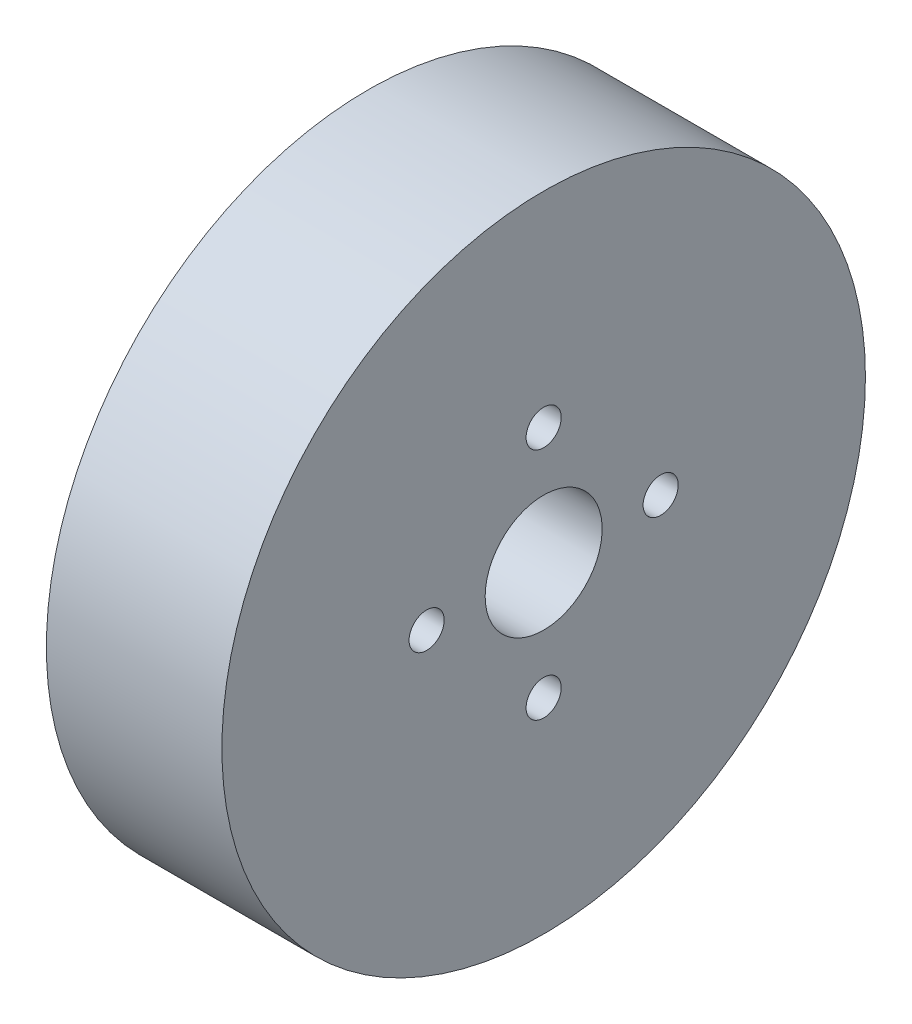
ISO-10303-21;
HEADER;
FILE_DESCRIPTION(('STEP AP214'),'2;1');
FILE_NAME('part.step','',(''),(''),'','','');
FILE_SCHEMA(('AUTOMOTIVE_DESIGN { 1 0 10303 214 1 1 1 1 }'));
ENDSEC;
DATA;
#1=APPLICATION_CONTEXT('core data for automotive mechanical design processes');
#2=APPLICATION_PROTOCOL_DEFINITION('international standard','automotive_design',2000,#1);
#3=PRODUCT_CONTEXT('',#1,'mechanical');
#4=PRODUCT('Part','Part','',(#3));
#5=PRODUCT_RELATED_PRODUCT_CATEGORY('part','',(#4));
#6=PRODUCT_DEFINITION_FORMATION('','',#4);
#7=PRODUCT_DEFINITION_CONTEXT('part definition',#1,'design');
#8=PRODUCT_DEFINITION('design','',#6,#7);
#9=PRODUCT_DEFINITION_SHAPE('','',#8);
#10=(LENGTH_UNIT() NAMED_UNIT(*) SI_UNIT(.MILLI.,.METRE.));
#11=(NAMED_UNIT(*) PLANE_ANGLE_UNIT() SI_UNIT($,.RADIAN.));
#12=(NAMED_UNIT(*) SI_UNIT($,.STERADIAN.) SOLID_ANGLE_UNIT());
#13=UNCERTAINTY_MEASURE_WITH_UNIT(LENGTH_MEASURE(1.E-05),#10,'distance_accuracy_value','');
#14=(GEOMETRIC_REPRESENTATION_CONTEXT(3) GLOBAL_UNCERTAINTY_ASSIGNED_CONTEXT((#13)) GLOBAL_UNIT_ASSIGNED_CONTEXT((#10,
#11,#12)) REPRESENTATION_CONTEXT('',''));
#15=CARTESIAN_POINT('',(0.,0.,0.));
#16=DIRECTION('',(0.,0.,1.));
#17=DIRECTION('',(1.,0.,0.));
#18=AXIS2_PLACEMENT_3D('',#15,#16,#17);
#19=CARTESIAN_POINT('',(15.,14.0619228503121,18.795257752469));
#20=DIRECTION('',(-1.,0.,0.));
#21=DIRECTION('',(0.,0.,1.));
#22=AXIS2_PLACEMENT_3D('',#19,#20,#21);
#23=CYLINDRICAL_SURFACE('',#22,27.5);
#24=CARTESIAN_POINT('',(15.,14.0619228503121,18.795257752469));
#25=DIRECTION('',(1.,0.,0.));
#26=DIRECTION('',(0.,0.,-1.));
#27=AXIS2_PLACEMENT_3D('',#24,#25,#26);
#28=CIRCLE('',#27,27.5);
#29=CARTESIAN_POINT('',(15.,14.0619228503121,-8.70474224753096));
#30=VERTEX_POINT('',#29);
#31=EDGE_CURVE('E10',#30,#30,#28,.T.);
#32=ORIENTED_EDGE('',*,*,#31,.F.);
#33=EDGE_LOOP('',(#32));
#34=FACE_BOUND('',#33,.T.);
#35=CARTESIAN_POINT('',(0.,14.0619228503121,18.795257752469));
#36=DIRECTION('',(1.,0.,0.));
#37=DIRECTION('',(0.,0.,-1.));
#38=AXIS2_PLACEMENT_3D('',#35,#36,#37);
#39=CIRCLE('',#38,27.5);
#40=CARTESIAN_POINT('',(0.,14.0619228503121,-8.70474224753096));
#41=VERTEX_POINT('',#40);
#42=EDGE_CURVE('E35',#41,#41,#39,.T.);
#43=ORIENTED_EDGE('',*,*,#42,.T.);
#44=EDGE_LOOP('',(#43));
#45=FACE_BOUND('',#44,.T.);
#46=ADVANCED_FACE('F32',(#34,#45),#23,.T.);
#47=CARTESIAN_POINT('',(15.,14.0619228503121,18.795257752469));
#48=DIRECTION('',(1.,0.,0.));
#49=DIRECTION('',(0.,0.,-1.));
#50=AXIS2_PLACEMENT_3D('',#47,#48,#49);
#51=PLANE('',#50);
#52=CARTESIAN_POINT('',(15.,24.0619228503121,18.795257752469));
#53=DIRECTION('',(1.,0.,0.));
#54=DIRECTION('',(0.,0.,-1.));
#55=AXIS2_PLACEMENT_3D('',#52,#53,#54);
#56=CIRCLE('',#55,1.5);
#57=CARTESIAN_POINT('',(15.,24.0619228503121,20.295257752469));
#58=VERTEX_POINT('',#57);
#59=EDGE_CURVE('E57',#58,#58,#56,.F.);
#60=ORIENTED_EDGE('',*,*,#59,.T.);
#61=EDGE_LOOP('',(#60));
#62=FACE_BOUND('',#61,.T.);
#63=CARTESIAN_POINT('',(15.,14.0619228503121,28.795257752469));
#64=DIRECTION('',(1.,0.,0.));
#65=DIRECTION('',(0.,0.,-1.));
#66=AXIS2_PLACEMENT_3D('',#63,#64,#65);
#67=CIRCLE('',#66,1.5);
#68=CARTESIAN_POINT('',(15.,14.0619228503121,30.295257752469));
#69=VERTEX_POINT('',#68);
#70=EDGE_CURVE('E50',#69,#69,#67,.F.);
#71=ORIENTED_EDGE('',*,*,#70,.T.);
#72=EDGE_LOOP('',(#71));
#73=FACE_BOUND('',#72,.T.);
#74=CARTESIAN_POINT('',(15.,14.0619228503121,8.79525775246904));
#75=DIRECTION('',(1.,0.,0.));
#76=DIRECTION('',(0.,0.,-1.));
#77=AXIS2_PLACEMENT_3D('',#74,#75,#76);
#78=CIRCLE('',#77,1.5);
#79=CARTESIAN_POINT('',(15.,14.0619228503121,10.295257752469));
#80=VERTEX_POINT('',#79);
#81=EDGE_CURVE('E68',#80,#80,#78,.F.);
#82=ORIENTED_EDGE('',*,*,#81,.T.);
#83=EDGE_LOOP('',(#82));
#84=FACE_BOUND('',#83,.T.);
#85=CARTESIAN_POINT('',(15.,4.06192285031211,18.795257752469));
#86=DIRECTION('',(1.,0.,0.));
#87=DIRECTION('',(0.,0.,-1.));
#88=AXIS2_PLACEMENT_3D('',#85,#86,#87);
#89=CIRCLE('',#88,1.5);
#90=CARTESIAN_POINT('',(15.,4.06192285031211,20.295257752469));
#91=VERTEX_POINT('',#90);
#92=EDGE_CURVE('E62',#91,#91,#89,.F.);
#93=ORIENTED_EDGE('',*,*,#92,.T.);
#94=EDGE_LOOP('',(#93));
#95=FACE_BOUND('',#94,.T.);
#96=CARTESIAN_POINT('',(15.,14.0619228503121,18.795257752469));
#97=DIRECTION('',(1.,0.,0.));
#98=DIRECTION('',(0.,0.,-1.));
#99=AXIS2_PLACEMENT_3D('',#96,#97,#98);
#100=CIRCLE('',#99,5.);
#101=CARTESIAN_POINT('',(15.,14.0619228503121,23.795257752469));
#102=VERTEX_POINT('',#101);
#103=EDGE_CURVE('E44',#102,#102,#100,.F.);
#104=ORIENTED_EDGE('',*,*,#103,.T.);
#105=EDGE_LOOP('',(#104));
#106=FACE_BOUND('',#105,.T.);
#107=ORIENTED_EDGE('',*,*,#31,.T.);
#108=EDGE_LOOP('',(#107));
#109=FACE_BOUND('',#108,.T.);
#110=ADVANCED_FACE('F80',(#62,#73,#84,#95,#106,#109),#51,.T.);
#111=CARTESIAN_POINT('',(0.,14.0619228503121,18.795257752469));
#112=DIRECTION('',(1.,0.,0.));
#113=DIRECTION('',(0.,0.,-1.));
#114=AXIS2_PLACEMENT_3D('',#111,#112,#113);
#115=PLANE('',#114);
#116=CARTESIAN_POINT('',(0.,24.0619228503121,18.795257752469));
#117=DIRECTION('',(-1.,0.,0.));
#118=DIRECTION('',(0.,0.,1.));
#119=AXIS2_PLACEMENT_3D('',#116,#117,#118);
#120=CIRCLE('',#119,1.5);
#121=CARTESIAN_POINT('',(0.,24.0619228503121,20.295257752469));
#122=VERTEX_POINT('',#121);
#123=EDGE_CURVE('E47',#122,#122,#120,.T.);
#124=ORIENTED_EDGE('',*,*,#123,.F.);
#125=EDGE_LOOP('',(#124));
#126=FACE_BOUND('',#125,.T.);
#127=CARTESIAN_POINT('',(0.,14.0619228503121,28.795257752469));
#128=DIRECTION('',(-1.,0.,0.));
#129=DIRECTION('',(0.,0.,1.));
#130=AXIS2_PLACEMENT_3D('',#127,#128,#129);
#131=CIRCLE('',#130,1.5);
#132=CARTESIAN_POINT('',(0.,14.0619228503121,30.295257752469));
#133=VERTEX_POINT('',#132);
#134=EDGE_CURVE('E53',#133,#133,#131,.T.);
#135=ORIENTED_EDGE('',*,*,#134,.F.);
#136=EDGE_LOOP('',(#135));
#137=FACE_BOUND('',#136,.T.);
#138=CARTESIAN_POINT('',(0.,14.0619228503121,8.79525775246904));
#139=DIRECTION('',(-1.,0.,0.));
#140=DIRECTION('',(0.,0.,1.));
#141=AXIS2_PLACEMENT_3D('',#138,#139,#140);
#142=CIRCLE('',#141,1.5);
#143=CARTESIAN_POINT('',(0.,14.0619228503121,10.295257752469));
#144=VERTEX_POINT('',#143);
#145=EDGE_CURVE('E54',#144,#144,#142,.T.);
#146=ORIENTED_EDGE('',*,*,#145,.F.);
#147=EDGE_LOOP('',(#146));
#148=FACE_BOUND('',#147,.T.);
#149=CARTESIAN_POINT('',(0.,4.06192285031211,18.795257752469));
#150=DIRECTION('',(-1.,0.,0.));
#151=DIRECTION('',(0.,0.,1.));
#152=AXIS2_PLACEMENT_3D('',#149,#150,#151);
#153=CIRCLE('',#152,1.5);
#154=CARTESIAN_POINT('',(0.,4.06192285031211,20.295257752469));
#155=VERTEX_POINT('',#154);
#156=EDGE_CURVE('E65',#155,#155,#153,.T.);
#157=ORIENTED_EDGE('',*,*,#156,.F.);
#158=EDGE_LOOP('',(#157));
#159=FACE_BOUND('',#158,.T.);
#160=CARTESIAN_POINT('',(0.,14.0619228503121,18.795257752469));
#161=DIRECTION('',(-1.,0.,0.));
#162=DIRECTION('',(0.,0.,1.));
#163=AXIS2_PLACEMENT_3D('',#160,#161,#162);
#164=CIRCLE('',#163,5.);
#165=CARTESIAN_POINT('',(0.,14.0619228503121,23.795257752469));
#166=VERTEX_POINT('',#165);
#167=EDGE_CURVE('E42',#166,#166,#164,.T.);
#168=ORIENTED_EDGE('',*,*,#167,.F.);
#169=EDGE_LOOP('',(#168));
#170=FACE_BOUND('',#169,.T.);
#171=ORIENTED_EDGE('',*,*,#42,.F.);
#172=EDGE_LOOP('',(#171));
#173=FACE_BOUND('',#172,.T.);
#174=ADVANCED_FACE('F76',(#126,#137,#148,#159,#170,#173),#115,.F.);
#175=CARTESIAN_POINT('',(15.001,14.0619228503121,18.795257752469));
#176=DIRECTION('',(-1.,0.,0.));
#177=DIRECTION('',(0.,0.,1.));
#178=AXIS2_PLACEMENT_3D('',#175,#176,#177);
#179=CYLINDRICAL_SURFACE('',#178,5.);
#180=CARTESIAN_POINT('',(15.,14.0619228503121,23.795257752469));
#181=CARTESIAN_POINT('',(14.84375,14.0619228503121,23.795257752469));
#182=CARTESIAN_POINT('',(14.6875,14.0619228503121,23.795257752469));
#183=CARTESIAN_POINT('',(14.375,14.0619228503121,23.795257752469));
#184=CARTESIAN_POINT('',(14.21875,14.0619228503121,23.795257752469));
#185=CARTESIAN_POINT('',(13.90625,14.0619228503121,23.795257752469));
#186=CARTESIAN_POINT('',(13.75,14.0619228503121,23.795257752469));
#187=CARTESIAN_POINT('',(13.4375,14.0619228503121,23.795257752469));
#188=CARTESIAN_POINT('',(13.28125,14.0619228503121,23.795257752469));
#189=CARTESIAN_POINT('',(12.96875,14.0619228503121,23.795257752469));
#190=CARTESIAN_POINT('',(12.8125,14.0619228503121,23.795257752469));
#191=CARTESIAN_POINT('',(12.5,14.0619228503121,23.795257752469));
#192=CARTESIAN_POINT('',(12.34375,14.0619228503121,23.795257752469));
#193=CARTESIAN_POINT('',(12.03125,14.0619228503121,23.795257752469));
#194=CARTESIAN_POINT('',(11.875,14.0619228503121,23.795257752469));
#195=CARTESIAN_POINT('',(11.5625,14.0619228503121,23.795257752469));
#196=CARTESIAN_POINT('',(11.40625,14.0619228503121,23.795257752469));
#197=CARTESIAN_POINT('',(11.09375,14.0619228503121,23.795257752469));
#198=CARTESIAN_POINT('',(10.9375,14.0619228503121,23.795257752469));
#199=CARTESIAN_POINT('',(10.625,14.0619228503121,23.795257752469));
#200=CARTESIAN_POINT('',(10.46875,14.0619228503121,23.795257752469));
#201=CARTESIAN_POINT('',(10.15625,14.0619228503121,23.795257752469));
#202=CARTESIAN_POINT('',(10.,14.0619228503121,23.795257752469));
#203=CARTESIAN_POINT('',(9.6875,14.0619228503121,23.795257752469));
#204=CARTESIAN_POINT('',(9.53125,14.0619228503121,23.795257752469));
#205=CARTESIAN_POINT('',(9.21875,14.0619228503121,23.795257752469));
#206=CARTESIAN_POINT('',(9.0625,14.0619228503121,23.795257752469));
#207=CARTESIAN_POINT('',(8.75,14.0619228503121,23.795257752469));
#208=CARTESIAN_POINT('',(8.59375,14.0619228503121,23.795257752469));
#209=CARTESIAN_POINT('',(8.28125,14.0619228503121,23.795257752469));
#210=CARTESIAN_POINT('',(8.125,14.0619228503121,23.795257752469));
#211=CARTESIAN_POINT('',(7.8125,14.0619228503121,23.795257752469));
#212=CARTESIAN_POINT('',(7.65625,14.0619228503121,23.795257752469));
#213=CARTESIAN_POINT('',(7.34375,14.0619228503121,23.795257752469));
#214=CARTESIAN_POINT('',(7.1875,14.0619228503121,23.795257752469));
#215=CARTESIAN_POINT('',(6.875,14.0619228503121,23.795257752469));
#216=CARTESIAN_POINT('',(6.71875,14.0619228503121,23.795257752469));
#217=CARTESIAN_POINT('',(6.40625,14.0619228503121,23.795257752469));
#218=CARTESIAN_POINT('',(6.25,14.0619228503121,23.795257752469));
#219=CARTESIAN_POINT('',(5.9375,14.0619228503121,23.795257752469));
#220=CARTESIAN_POINT('',(5.78125,14.0619228503121,23.795257752469));
#221=CARTESIAN_POINT('',(5.46875,14.0619228503121,23.795257752469));
#222=CARTESIAN_POINT('',(5.3125,14.0619228503121,23.795257752469));
#223=CARTESIAN_POINT('',(5.,14.0619228503121,23.795257752469));
#224=CARTESIAN_POINT('',(4.84375,14.0619228503121,23.795257752469));
#225=CARTESIAN_POINT('',(4.53125,14.0619228503121,23.795257752469));
#226=CARTESIAN_POINT('',(4.375,14.0619228503121,23.795257752469));
#227=CARTESIAN_POINT('',(4.0625,14.0619228503121,23.795257752469));
#228=CARTESIAN_POINT('',(3.90625,14.0619228503121,23.795257752469));
#229=CARTESIAN_POINT('',(3.59375,14.0619228503121,23.795257752469));
#230=CARTESIAN_POINT('',(3.4375,14.0619228503121,23.795257752469));
#231=CARTESIAN_POINT('',(3.125,14.0619228503121,23.795257752469));
#232=CARTESIAN_POINT('',(2.96875,14.0619228503121,23.795257752469));
#233=CARTESIAN_POINT('',(2.65625,14.0619228503121,23.795257752469));
#234=CARTESIAN_POINT('',(2.5,14.0619228503121,23.795257752469));
#235=CARTESIAN_POINT('',(2.1875,14.0619228503121,23.795257752469));
#236=CARTESIAN_POINT('',(2.03125,14.0619228503121,23.795257752469));
#237=CARTESIAN_POINT('',(1.71875,14.0619228503121,23.795257752469));
#238=CARTESIAN_POINT('',(1.5625,14.0619228503121,23.795257752469));
#239=CARTESIAN_POINT('',(1.25,14.0619228503121,23.795257752469));
#240=CARTESIAN_POINT('',(1.09375,14.0619228503121,23.795257752469));
#241=CARTESIAN_POINT('',(0.781250000000001,14.0619228503121,23.795257752469));
#242=CARTESIAN_POINT('',(0.625000000000001,14.0619228503121,23.795257752469));
#243=CARTESIAN_POINT('',(0.3125,14.0619228503121,23.795257752469));
#244=CARTESIAN_POINT('',(0.15625,14.0619228503121,23.795257752469));
#245=CARTESIAN_POINT('',(0.,14.0619228503121,23.795257752469));
#246=B_SPLINE_CURVE_WITH_KNOTS('',3,(#180,#181,#182,#183,#184,#185,#186,#187,#188,#189,#190,
#191,#192,#193,#194,#195,#196,#197,#198,#199,#200,#201,#202,#203,#204,#205,#206,#207,#208,#209,
#210,#211,#212,#213,#214,#215,#216,#217,#218,#219,#220,#221,#222,#223,#224,#225,#226,#227,#228,
#229,#230,#231,#232,#233,#234,#235,#236,#237,#238,#239,#240,#241,#242,#243,#244,#245),
.UNSPECIFIED.,.F.,.F.,(4,2,2,2,2,2,2,2,2,2,2,2,2,2,2,2,2,2,2,2,2,2,2,2,2,2,2,2,2,2,2,2,4),(0.,
0.468749999999999,0.937499999999999,1.40625,1.875,2.34375,2.8125,3.28125,3.75,4.21875,4.6875,
5.15625,5.625,6.09375,6.5625,7.03125,7.5,7.96875,8.4375,8.90625,9.375,9.84375,10.3125,10.78125,
11.25,11.71875,12.1875,12.65625,13.125,13.59375,14.0625,14.53125,15.),.UNSPECIFIED.);
#247=EDGE_CURVE('BSEAM79',#102,#166,#246,.T.);
#248=ORIENTED_EDGE('',*,*,#103,.F.);
#249=ORIENTED_EDGE('',*,*,#167,.T.);
#250=ORIENTED_EDGE('',*,*,#247,.T.);
#251=ORIENTED_EDGE('',*,*,#247,.F.);
#252=EDGE_LOOP('',(#248,#250,#249,#251));
#253=FACE_BOUND('',#252,.T.);
#254=ADVANCED_FACE('F79',(#253),#179,.F.);
#255=CARTESIAN_POINT('',(15.001,4.06192285031211,18.795257752469));
#256=DIRECTION('',(-1.,0.,0.));
#257=DIRECTION('',(0.,0.,1.));
#258=AXIS2_PLACEMENT_3D('',#255,#256,#257);
#259=CYLINDRICAL_SURFACE('',#258,1.5);
#260=CARTESIAN_POINT('',(15.,4.06192285031211,20.295257752469));
#261=CARTESIAN_POINT('',(14.84375,4.06192285031211,20.295257752469));
#262=CARTESIAN_POINT('',(14.6875,4.06192285031211,20.295257752469));
#263=CARTESIAN_POINT('',(14.375,4.06192285031211,20.295257752469));
#264=CARTESIAN_POINT('',(14.21875,4.06192285031211,20.295257752469));
#265=CARTESIAN_POINT('',(13.90625,4.06192285031211,20.295257752469));
#266=CARTESIAN_POINT('',(13.75,4.06192285031211,20.295257752469));
#267=CARTESIAN_POINT('',(13.4375,4.06192285031211,20.295257752469));
#268=CARTESIAN_POINT('',(13.28125,4.06192285031211,20.295257752469));
#269=CARTESIAN_POINT('',(12.96875,4.06192285031211,20.295257752469));
#270=CARTESIAN_POINT('',(12.8125,4.06192285031211,20.295257752469));
#271=CARTESIAN_POINT('',(12.5,4.06192285031211,20.295257752469));
#272=CARTESIAN_POINT('',(12.34375,4.06192285031211,20.295257752469));
#273=CARTESIAN_POINT('',(12.03125,4.06192285031211,20.295257752469));
#274=CARTESIAN_POINT('',(11.875,4.06192285031211,20.295257752469));
#275=CARTESIAN_POINT('',(11.5625,4.06192285031211,20.295257752469));
#276=CARTESIAN_POINT('',(11.40625,4.06192285031211,20.295257752469));
#277=CARTESIAN_POINT('',(11.09375,4.06192285031211,20.295257752469));
#278=CARTESIAN_POINT('',(10.9375,4.06192285031211,20.295257752469));
#279=CARTESIAN_POINT('',(10.625,4.06192285031211,20.295257752469));
#280=CARTESIAN_POINT('',(10.46875,4.06192285031211,20.295257752469));
#281=CARTESIAN_POINT('',(10.15625,4.06192285031211,20.295257752469));
#282=CARTESIAN_POINT('',(10.,4.06192285031211,20.295257752469));
#283=CARTESIAN_POINT('',(9.6875,4.06192285031211,20.295257752469));
#284=CARTESIAN_POINT('',(9.53125,4.06192285031211,20.295257752469));
#285=CARTESIAN_POINT('',(9.21875,4.06192285031211,20.295257752469));
#286=CARTESIAN_POINT('',(9.0625,4.06192285031211,20.295257752469));
#287=CARTESIAN_POINT('',(8.75,4.06192285031211,20.295257752469));
#288=CARTESIAN_POINT('',(8.59375,4.06192285031211,20.295257752469));
#289=CARTESIAN_POINT('',(8.28125,4.06192285031211,20.295257752469));
#290=CARTESIAN_POINT('',(8.125,4.06192285031211,20.295257752469));
#291=CARTESIAN_POINT('',(7.8125,4.06192285031211,20.295257752469));
#292=CARTESIAN_POINT('',(7.65625,4.06192285031211,20.295257752469));
#293=CARTESIAN_POINT('',(7.34375,4.06192285031211,20.295257752469));
#294=CARTESIAN_POINT('',(7.1875,4.06192285031211,20.295257752469));
#295=CARTESIAN_POINT('',(6.875,4.06192285031211,20.295257752469));
#296=CARTESIAN_POINT('',(6.71875,4.06192285031211,20.295257752469));
#297=CARTESIAN_POINT('',(6.40625,4.06192285031211,20.295257752469));
#298=CARTESIAN_POINT('',(6.25,4.06192285031211,20.295257752469));
#299=CARTESIAN_POINT('',(5.9375,4.06192285031211,20.295257752469));
#300=CARTESIAN_POINT('',(5.78125,4.06192285031211,20.295257752469));
#301=CARTESIAN_POINT('',(5.46875,4.06192285031211,20.295257752469));
#302=CARTESIAN_POINT('',(5.3125,4.06192285031211,20.295257752469));
#303=CARTESIAN_POINT('',(5.,4.06192285031211,20.295257752469));
#304=CARTESIAN_POINT('',(4.84375,4.06192285031211,20.295257752469));
#305=CARTESIAN_POINT('',(4.53125,4.06192285031211,20.295257752469));
#306=CARTESIAN_POINT('',(4.375,4.06192285031211,20.295257752469));
#307=CARTESIAN_POINT('',(4.0625,4.06192285031211,20.295257752469));
#308=CARTESIAN_POINT('',(3.90625,4.06192285031211,20.295257752469));
#309=CARTESIAN_POINT('',(3.59375,4.06192285031211,20.295257752469));
#310=CARTESIAN_POINT('',(3.4375,4.06192285031211,20.295257752469));
#311=CARTESIAN_POINT('',(3.125,4.06192285031211,20.295257752469));
#312=CARTESIAN_POINT('',(2.96875,4.06192285031211,20.295257752469));
#313=CARTESIAN_POINT('',(2.65625,4.06192285031211,20.295257752469));
#314=CARTESIAN_POINT('',(2.5,4.06192285031211,20.295257752469));
#315=CARTESIAN_POINT('',(2.1875,4.06192285031211,20.295257752469));
#316=CARTESIAN_POINT('',(2.03125,4.06192285031211,20.295257752469));
#317=CARTESIAN_POINT('',(1.71875,4.06192285031211,20.295257752469));
#318=CARTESIAN_POINT('',(1.5625,4.06192285031211,20.295257752469));
#319=CARTESIAN_POINT('',(1.25,4.06192285031211,20.295257752469));
#320=CARTESIAN_POINT('',(1.09375,4.06192285031211,20.295257752469));
#321=CARTESIAN_POINT('',(0.781250000000001,4.06192285031211,20.295257752469));
#322=CARTESIAN_POINT('',(0.625000000000001,4.06192285031211,20.295257752469));
#323=CARTESIAN_POINT('',(0.3125,4.06192285031211,20.295257752469));
#324=CARTESIAN_POINT('',(0.15625,4.06192285031211,20.295257752469));
#325=CARTESIAN_POINT('',(0.,4.06192285031211,20.295257752469));
#326=B_SPLINE_CURVE_WITH_KNOTS('',3,(#260,#261,#262,#263,#264,#265,#266,#267,#268,#269,#270,
#271,#272,#273,#274,#275,#276,#277,#278,#279,#280,#281,#282,#283,#284,#285,#286,#287,#288,#289,
#290,#291,#292,#293,#294,#295,#296,#297,#298,#299,#300,#301,#302,#303,#304,#305,#306,#307,#308,
#309,#310,#311,#312,#313,#314,#315,#316,#317,#318,#319,#320,#321,#322,#323,#324,#325),
.UNSPECIFIED.,.F.,.F.,(4,2,2,2,2,2,2,2,2,2,2,2,2,2,2,2,2,2,2,2,2,2,2,2,2,2,2,2,2,2,2,2,4),(0.,
0.468749999999999,0.937499999999999,1.40625,1.875,2.34375,2.8125,3.28125,3.75,4.21875,4.6875,
5.15625,5.625,6.09375,6.5625,7.03125,7.5,7.96875,8.4375,8.90625,9.375,9.84375,10.3125,10.78125,
11.25,11.71875,12.1875,12.65625,13.125,13.59375,14.0625,14.53125,15.),.UNSPECIFIED.);
#327=EDGE_CURVE('BSEAM101',#91,#155,#326,.T.);
#328=ORIENTED_EDGE('',*,*,#92,.F.);
#329=ORIENTED_EDGE('',*,*,#156,.T.);
#330=ORIENTED_EDGE('',*,*,#327,.T.);
#331=ORIENTED_EDGE('',*,*,#327,.F.);
#332=EDGE_LOOP('',(#328,#330,#329,#331));
#333=FACE_BOUND('',#332,.T.);
#334=ADVANCED_FACE('F101',(#333),#259,.F.);
#335=CARTESIAN_POINT('',(15.001,14.0619228503121,8.79525775246904));
#336=DIRECTION('',(-1.,0.,0.));
#337=DIRECTION('',(0.,0.,1.));
#338=AXIS2_PLACEMENT_3D('',#335,#336,#337);
#339=CYLINDRICAL_SURFACE('',#338,1.5);
#340=CARTESIAN_POINT('',(15.,14.0619228503121,10.295257752469));
#341=CARTESIAN_POINT('',(14.84375,14.0619228503121,10.295257752469));
#342=CARTESIAN_POINT('',(14.6875,14.0619228503121,10.295257752469));
#343=CARTESIAN_POINT('',(14.375,14.0619228503121,10.295257752469));
#344=CARTESIAN_POINT('',(14.21875,14.0619228503121,10.295257752469));
#345=CARTESIAN_POINT('',(13.90625,14.0619228503121,10.295257752469));
#346=CARTESIAN_POINT('',(13.75,14.0619228503121,10.295257752469));
#347=CARTESIAN_POINT('',(13.4375,14.0619228503121,10.295257752469));
#348=CARTESIAN_POINT('',(13.28125,14.0619228503121,10.295257752469));
#349=CARTESIAN_POINT('',(12.96875,14.0619228503121,10.295257752469));
#350=CARTESIAN_POINT('',(12.8125,14.0619228503121,10.295257752469));
#351=CARTESIAN_POINT('',(12.5,14.0619228503121,10.295257752469));
#352=CARTESIAN_POINT('',(12.34375,14.0619228503121,10.295257752469));
#353=CARTESIAN_POINT('',(12.03125,14.0619228503121,10.295257752469));
#354=CARTESIAN_POINT('',(11.875,14.0619228503121,10.295257752469));
#355=CARTESIAN_POINT('',(11.5625,14.0619228503121,10.295257752469));
#356=CARTESIAN_POINT('',(11.40625,14.0619228503121,10.295257752469));
#357=CARTESIAN_POINT('',(11.09375,14.0619228503121,10.295257752469));
#358=CARTESIAN_POINT('',(10.9375,14.0619228503121,10.295257752469));
#359=CARTESIAN_POINT('',(10.625,14.0619228503121,10.295257752469));
#360=CARTESIAN_POINT('',(10.46875,14.0619228503121,10.295257752469));
#361=CARTESIAN_POINT('',(10.15625,14.0619228503121,10.295257752469));
#362=CARTESIAN_POINT('',(10.,14.0619228503121,10.295257752469));
#363=CARTESIAN_POINT('',(9.6875,14.0619228503121,10.295257752469));
#364=CARTESIAN_POINT('',(9.53125,14.0619228503121,10.295257752469));
#365=CARTESIAN_POINT('',(9.21875,14.0619228503121,10.295257752469));
#366=CARTESIAN_POINT('',(9.0625,14.0619228503121,10.295257752469));
#367=CARTESIAN_POINT('',(8.75,14.0619228503121,10.295257752469));
#368=CARTESIAN_POINT('',(8.59375,14.0619228503121,10.295257752469));
#369=CARTESIAN_POINT('',(8.28125,14.0619228503121,10.295257752469));
#370=CARTESIAN_POINT('',(8.125,14.0619228503121,10.295257752469));
#371=CARTESIAN_POINT('',(7.8125,14.0619228503121,10.295257752469));
#372=CARTESIAN_POINT('',(7.65625,14.0619228503121,10.295257752469));
#373=CARTESIAN_POINT('',(7.34375,14.0619228503121,10.295257752469));
#374=CARTESIAN_POINT('',(7.1875,14.0619228503121,10.295257752469));
#375=CARTESIAN_POINT('',(6.875,14.0619228503121,10.295257752469));
#376=CARTESIAN_POINT('',(6.71875,14.0619228503121,10.295257752469));
#377=CARTESIAN_POINT('',(6.40625,14.0619228503121,10.295257752469));
#378=CARTESIAN_POINT('',(6.25,14.0619228503121,10.295257752469));
#379=CARTESIAN_POINT('',(5.9375,14.0619228503121,10.295257752469));
#380=CARTESIAN_POINT('',(5.78125,14.0619228503121,10.295257752469));
#381=CARTESIAN_POINT('',(5.46875,14.0619228503121,10.295257752469));
#382=CARTESIAN_POINT('',(5.3125,14.0619228503121,10.295257752469));
#383=CARTESIAN_POINT('',(5.,14.0619228503121,10.295257752469));
#384=CARTESIAN_POINT('',(4.84375,14.0619228503121,10.295257752469));
#385=CARTESIAN_POINT('',(4.53125,14.0619228503121,10.295257752469));
#386=CARTESIAN_POINT('',(4.375,14.0619228503121,10.295257752469));
#387=CARTESIAN_POINT('',(4.0625,14.0619228503121,10.295257752469));
#388=CARTESIAN_POINT('',(3.90625,14.0619228503121,10.295257752469));
#389=CARTESIAN_POINT('',(3.59375,14.0619228503121,10.295257752469));
#390=CARTESIAN_POINT('',(3.4375,14.0619228503121,10.295257752469));
#391=CARTESIAN_POINT('',(3.125,14.0619228503121,10.295257752469));
#392=CARTESIAN_POINT('',(2.96875,14.0619228503121,10.295257752469));
#393=CARTESIAN_POINT('',(2.65625,14.0619228503121,10.295257752469));
#394=CARTESIAN_POINT('',(2.5,14.0619228503121,10.295257752469));
#395=CARTESIAN_POINT('',(2.1875,14.0619228503121,10.295257752469));
#396=CARTESIAN_POINT('',(2.03125,14.0619228503121,10.295257752469));
#397=CARTESIAN_POINT('',(1.71875,14.0619228503121,10.295257752469));
#398=CARTESIAN_POINT('',(1.5625,14.0619228503121,10.295257752469));
#399=CARTESIAN_POINT('',(1.25,14.0619228503121,10.295257752469));
#400=CARTESIAN_POINT('',(1.09375,14.0619228503121,10.295257752469));
#401=CARTESIAN_POINT('',(0.781250000000001,14.0619228503121,10.295257752469));
#402=CARTESIAN_POINT('',(0.625000000000001,14.0619228503121,10.295257752469));
#403=CARTESIAN_POINT('',(0.3125,14.0619228503121,10.295257752469));
#404=CARTESIAN_POINT('',(0.15625,14.0619228503121,10.295257752469));
#405=CARTESIAN_POINT('',(0.,14.0619228503121,10.295257752469));
#406=B_SPLINE_CURVE_WITH_KNOTS('',3,(#340,#341,#342,#343,#344,#345,#346,#347,#348,#349,#350,
#351,#352,#353,#354,#355,#356,#357,#358,#359,#360,#361,#362,#363,#364,#365,#366,#367,#368,#369,
#370,#371,#372,#373,#374,#375,#376,#377,#378,#379,#380,#381,#382,#383,#384,#385,#386,#387,#388,
#389,#390,#391,#392,#393,#394,#395,#396,#397,#398,#399,#400,#401,#402,#403,#404,#405),
.UNSPECIFIED.,.F.,.F.,(4,2,2,2,2,2,2,2,2,2,2,2,2,2,2,2,2,2,2,2,2,2,2,2,2,2,2,2,2,2,2,2,4),(0.,
0.468749999999999,0.937499999999999,1.40625,1.875,2.34375,2.8125,3.28125,3.75,4.21875,4.6875,
5.15625,5.625,6.09375,6.5625,7.03125,7.5,7.96875,8.4375,8.90625,9.375,9.84375,10.3125,10.78125,
11.25,11.71875,12.1875,12.65625,13.125,13.59375,14.0625,14.53125,15.),.UNSPECIFIED.);
#407=EDGE_CURVE('BSEAM74',#80,#144,#406,.T.);
#408=ORIENTED_EDGE('',*,*,#81,.F.);
#409=ORIENTED_EDGE('',*,*,#145,.T.);
#410=ORIENTED_EDGE('',*,*,#407,.T.);
#411=ORIENTED_EDGE('',*,*,#407,.F.);
#412=EDGE_LOOP('',(#408,#410,#409,#411));
#413=FACE_BOUND('',#412,.T.);
#414=ADVANCED_FACE('F74',(#413),#339,.F.);
#415=CARTESIAN_POINT('',(15.001,14.0619228503121,28.795257752469));
#416=DIRECTION('',(-1.,0.,0.));
#417=DIRECTION('',(0.,0.,1.));
#418=AXIS2_PLACEMENT_3D('',#415,#416,#417);
#419=CYLINDRICAL_SURFACE('',#418,1.5);
#420=CARTESIAN_POINT('',(15.,14.0619228503121,30.295257752469));
#421=CARTESIAN_POINT('',(14.84375,14.0619228503121,30.295257752469));
#422=CARTESIAN_POINT('',(14.6875,14.0619228503121,30.295257752469));
#423=CARTESIAN_POINT('',(14.375,14.0619228503121,30.295257752469));
#424=CARTESIAN_POINT('',(14.21875,14.0619228503121,30.295257752469));
#425=CARTESIAN_POINT('',(13.90625,14.0619228503121,30.295257752469));
#426=CARTESIAN_POINT('',(13.75,14.0619228503121,30.295257752469));
#427=CARTESIAN_POINT('',(13.4375,14.0619228503121,30.295257752469));
#428=CARTESIAN_POINT('',(13.28125,14.0619228503121,30.295257752469));
#429=CARTESIAN_POINT('',(12.96875,14.0619228503121,30.295257752469));
#430=CARTESIAN_POINT('',(12.8125,14.0619228503121,30.295257752469));
#431=CARTESIAN_POINT('',(12.5,14.0619228503121,30.295257752469));
#432=CARTESIAN_POINT('',(12.34375,14.0619228503121,30.295257752469));
#433=CARTESIAN_POINT('',(12.03125,14.0619228503121,30.295257752469));
#434=CARTESIAN_POINT('',(11.875,14.0619228503121,30.295257752469));
#435=CARTESIAN_POINT('',(11.5625,14.0619228503121,30.295257752469));
#436=CARTESIAN_POINT('',(11.40625,14.0619228503121,30.295257752469));
#437=CARTESIAN_POINT('',(11.09375,14.0619228503121,30.295257752469));
#438=CARTESIAN_POINT('',(10.9375,14.0619228503121,30.295257752469));
#439=CARTESIAN_POINT('',(10.625,14.0619228503121,30.295257752469));
#440=CARTESIAN_POINT('',(10.46875,14.0619228503121,30.295257752469));
#441=CARTESIAN_POINT('',(10.15625,14.0619228503121,30.295257752469));
#442=CARTESIAN_POINT('',(10.,14.0619228503121,30.295257752469));
#443=CARTESIAN_POINT('',(9.6875,14.0619228503121,30.295257752469));
#444=CARTESIAN_POINT('',(9.53125,14.0619228503121,30.295257752469));
#445=CARTESIAN_POINT('',(9.21875,14.0619228503121,30.295257752469));
#446=CARTESIAN_POINT('',(9.0625,14.0619228503121,30.295257752469));
#447=CARTESIAN_POINT('',(8.75,14.0619228503121,30.295257752469));
#448=CARTESIAN_POINT('',(8.59375,14.0619228503121,30.295257752469));
#449=CARTESIAN_POINT('',(8.28125,14.0619228503121,30.295257752469));
#450=CARTESIAN_POINT('',(8.125,14.0619228503121,30.295257752469));
#451=CARTESIAN_POINT('',(7.8125,14.0619228503121,30.295257752469));
#452=CARTESIAN_POINT('',(7.65625,14.0619228503121,30.295257752469));
#453=CARTESIAN_POINT('',(7.34375,14.0619228503121,30.295257752469));
#454=CARTESIAN_POINT('',(7.1875,14.0619228503121,30.295257752469));
#455=CARTESIAN_POINT('',(6.875,14.0619228503121,30.295257752469));
#456=CARTESIAN_POINT('',(6.71875,14.0619228503121,30.295257752469));
#457=CARTESIAN_POINT('',(6.40625,14.0619228503121,30.295257752469));
#458=CARTESIAN_POINT('',(6.25,14.0619228503121,30.295257752469));
#459=CARTESIAN_POINT('',(5.9375,14.0619228503121,30.295257752469));
#460=CARTESIAN_POINT('',(5.78125,14.0619228503121,30.295257752469));
#461=CARTESIAN_POINT('',(5.46875,14.0619228503121,30.295257752469));
#462=CARTESIAN_POINT('',(5.3125,14.0619228503121,30.295257752469));
#463=CARTESIAN_POINT('',(5.,14.0619228503121,30.295257752469));
#464=CARTESIAN_POINT('',(4.84375,14.0619228503121,30.295257752469));
#465=CARTESIAN_POINT('',(4.53125,14.0619228503121,30.295257752469));
#466=CARTESIAN_POINT('',(4.375,14.0619228503121,30.295257752469));
#467=CARTESIAN_POINT('',(4.0625,14.0619228503121,30.295257752469));
#468=CARTESIAN_POINT('',(3.90625,14.0619228503121,30.295257752469));
#469=CARTESIAN_POINT('',(3.59375,14.0619228503121,30.295257752469));
#470=CARTESIAN_POINT('',(3.4375,14.0619228503121,30.295257752469));
#471=CARTESIAN_POINT('',(3.125,14.0619228503121,30.295257752469));
#472=CARTESIAN_POINT('',(2.96875,14.0619228503121,30.295257752469));
#473=CARTESIAN_POINT('',(2.65625,14.0619228503121,30.295257752469));
#474=CARTESIAN_POINT('',(2.5,14.0619228503121,30.295257752469));
#475=CARTESIAN_POINT('',(2.1875,14.0619228503121,30.295257752469));
#476=CARTESIAN_POINT('',(2.03125,14.0619228503121,30.295257752469));
#477=CARTESIAN_POINT('',(1.71875,14.0619228503121,30.295257752469));
#478=CARTESIAN_POINT('',(1.5625,14.0619228503121,30.295257752469));
#479=CARTESIAN_POINT('',(1.25,14.0619228503121,30.295257752469));
#480=CARTESIAN_POINT('',(1.09375,14.0619228503121,30.295257752469));
#481=CARTESIAN_POINT('',(0.781250000000001,14.0619228503121,30.295257752469));
#482=CARTESIAN_POINT('',(0.625000000000001,14.0619228503121,30.295257752469));
#483=CARTESIAN_POINT('',(0.3125,14.0619228503121,30.295257752469));
#484=CARTESIAN_POINT('',(0.15625,14.0619228503121,30.295257752469));
#485=CARTESIAN_POINT('',(0.,14.0619228503121,30.295257752469));
#486=B_SPLINE_CURVE_WITH_KNOTS('',3,(#420,#421,#422,#423,#424,#425,#426,#427,#428,#429,#430,
#431,#432,#433,#434,#435,#436,#437,#438,#439,#440,#441,#442,#443,#444,#445,#446,#447,#448,#449,
#450,#451,#452,#453,#454,#455,#456,#457,#458,#459,#460,#461,#462,#463,#464,#465,#466,#467,#468,
#469,#470,#471,#472,#473,#474,#475,#476,#477,#478,#479,#480,#481,#482,#483,#484,#485),
.UNSPECIFIED.,.F.,.F.,(4,2,2,2,2,2,2,2,2,2,2,2,2,2,2,2,2,2,2,2,2,2,2,2,2,2,2,2,2,2,2,2,4),(0.,
0.468749999999999,0.937499999999999,1.40625,1.875,2.34375,2.8125,3.28125,3.75,4.21875,4.6875,
5.15625,5.625,6.09375,6.5625,7.03125,7.5,7.96875,8.4375,8.90625,9.375,9.84375,10.3125,10.78125,
11.25,11.71875,12.1875,12.65625,13.125,13.59375,14.0625,14.53125,15.),.UNSPECIFIED.);
#487=EDGE_CURVE('BSEAM103',#69,#133,#486,.T.);
#488=ORIENTED_EDGE('',*,*,#70,.F.);
#489=ORIENTED_EDGE('',*,*,#134,.T.);
#490=ORIENTED_EDGE('',*,*,#487,.T.);
#491=ORIENTED_EDGE('',*,*,#487,.F.);
#492=EDGE_LOOP('',(#488,#490,#489,#491));
#493=FACE_BOUND('',#492,.T.);
#494=ADVANCED_FACE('F103',(#493),#419,.F.);
#495=CARTESIAN_POINT('',(15.001,24.0619228503121,18.795257752469));
#496=DIRECTION('',(-1.,0.,0.));
#497=DIRECTION('',(0.,0.,1.));
#498=AXIS2_PLACEMENT_3D('',#495,#496,#497);
#499=CYLINDRICAL_SURFACE('',#498,1.5);
#500=CARTESIAN_POINT('',(15.,24.0619228503121,20.295257752469));
#501=CARTESIAN_POINT('',(14.84375,24.0619228503121,20.295257752469));
#502=CARTESIAN_POINT('',(14.6875,24.0619228503121,20.295257752469));
#503=CARTESIAN_POINT('',(14.375,24.0619228503121,20.295257752469));
#504=CARTESIAN_POINT('',(14.21875,24.0619228503121,20.295257752469));
#505=CARTESIAN_POINT('',(13.90625,24.0619228503121,20.295257752469));
#506=CARTESIAN_POINT('',(13.75,24.0619228503121,20.295257752469));
#507=CARTESIAN_POINT('',(13.4375,24.0619228503121,20.295257752469));
#508=CARTESIAN_POINT('',(13.28125,24.0619228503121,20.295257752469));
#509=CARTESIAN_POINT('',(12.96875,24.0619228503121,20.295257752469));
#510=CARTESIAN_POINT('',(12.8125,24.0619228503121,20.295257752469));
#511=CARTESIAN_POINT('',(12.5,24.0619228503121,20.295257752469));
#512=CARTESIAN_POINT('',(12.34375,24.0619228503121,20.295257752469));
#513=CARTESIAN_POINT('',(12.03125,24.0619228503121,20.295257752469));
#514=CARTESIAN_POINT('',(11.875,24.0619228503121,20.295257752469));
#515=CARTESIAN_POINT('',(11.5625,24.0619228503121,20.295257752469));
#516=CARTESIAN_POINT('',(11.40625,24.0619228503121,20.295257752469));
#517=CARTESIAN_POINT('',(11.09375,24.0619228503121,20.295257752469));
#518=CARTESIAN_POINT('',(10.9375,24.0619228503121,20.295257752469));
#519=CARTESIAN_POINT('',(10.625,24.0619228503121,20.295257752469));
#520=CARTESIAN_POINT('',(10.46875,24.0619228503121,20.295257752469));
#521=CARTESIAN_POINT('',(10.15625,24.0619228503121,20.295257752469));
#522=CARTESIAN_POINT('',(10.,24.0619228503121,20.295257752469));
#523=CARTESIAN_POINT('',(9.6875,24.0619228503121,20.295257752469));
#524=CARTESIAN_POINT('',(9.53125,24.0619228503121,20.295257752469));
#525=CARTESIAN_POINT('',(9.21875,24.0619228503121,20.295257752469));
#526=CARTESIAN_POINT('',(9.0625,24.0619228503121,20.295257752469));
#527=CARTESIAN_POINT('',(8.75,24.0619228503121,20.295257752469));
#528=CARTESIAN_POINT('',(8.59375,24.0619228503121,20.295257752469));
#529=CARTESIAN_POINT('',(8.28125,24.0619228503121,20.295257752469));
#530=CARTESIAN_POINT('',(8.125,24.0619228503121,20.295257752469));
#531=CARTESIAN_POINT('',(7.8125,24.0619228503121,20.295257752469));
#532=CARTESIAN_POINT('',(7.65625,24.0619228503121,20.295257752469));
#533=CARTESIAN_POINT('',(7.34375,24.0619228503121,20.295257752469));
#534=CARTESIAN_POINT('',(7.1875,24.0619228503121,20.295257752469));
#535=CARTESIAN_POINT('',(6.875,24.0619228503121,20.295257752469));
#536=CARTESIAN_POINT('',(6.71875,24.0619228503121,20.295257752469));
#537=CARTESIAN_POINT('',(6.40625,24.0619228503121,20.295257752469));
#538=CARTESIAN_POINT('',(6.25,24.0619228503121,20.295257752469));
#539=CARTESIAN_POINT('',(5.9375,24.0619228503121,20.295257752469));
#540=CARTESIAN_POINT('',(5.78125,24.0619228503121,20.295257752469));
#541=CARTESIAN_POINT('',(5.46875,24.0619228503121,20.295257752469));
#542=CARTESIAN_POINT('',(5.3125,24.0619228503121,20.295257752469));
#543=CARTESIAN_POINT('',(5.,24.0619228503121,20.295257752469));
#544=CARTESIAN_POINT('',(4.84375,24.0619228503121,20.295257752469));
#545=CARTESIAN_POINT('',(4.53125,24.0619228503121,20.295257752469));
#546=CARTESIAN_POINT('',(4.375,24.0619228503121,20.295257752469));
#547=CARTESIAN_POINT('',(4.0625,24.0619228503121,20.295257752469));
#548=CARTESIAN_POINT('',(3.90625,24.0619228503121,20.295257752469));
#549=CARTESIAN_POINT('',(3.59375,24.0619228503121,20.295257752469));
#550=CARTESIAN_POINT('',(3.4375,24.0619228503121,20.295257752469));
#551=CARTESIAN_POINT('',(3.125,24.0619228503121,20.295257752469));
#552=CARTESIAN_POINT('',(2.96875,24.0619228503121,20.295257752469));
#553=CARTESIAN_POINT('',(2.65625,24.0619228503121,20.295257752469));
#554=CARTESIAN_POINT('',(2.5,24.0619228503121,20.295257752469));
#555=CARTESIAN_POINT('',(2.1875,24.0619228503121,20.295257752469));
#556=CARTESIAN_POINT('',(2.03125,24.0619228503121,20.295257752469));
#557=CARTESIAN_POINT('',(1.71875,24.0619228503121,20.295257752469));
#558=CARTESIAN_POINT('',(1.5625,24.0619228503121,20.295257752469));
#559=CARTESIAN_POINT('',(1.25,24.0619228503121,20.295257752469));
#560=CARTESIAN_POINT('',(1.09375,24.0619228503121,20.295257752469));
#561=CARTESIAN_POINT('',(0.781250000000001,24.0619228503121,20.295257752469));
#562=CARTESIAN_POINT('',(0.625000000000001,24.0619228503121,20.295257752469));
#563=CARTESIAN_POINT('',(0.3125,24.0619228503121,20.295257752469));
#564=CARTESIAN_POINT('',(0.15625,24.0619228503121,20.295257752469));
#565=CARTESIAN_POINT('',(0.,24.0619228503121,20.295257752469));
#566=B_SPLINE_CURVE_WITH_KNOTS('',3,(#500,#501,#502,#503,#504,#505,#506,#507,#508,#509,#510,
#511,#512,#513,#514,#515,#516,#517,#518,#519,#520,#521,#522,#523,#524,#525,#526,#527,#528,#529,
#530,#531,#532,#533,#534,#535,#536,#537,#538,#539,#540,#541,#542,#543,#544,#545,#546,#547,#548,
#549,#550,#551,#552,#553,#554,#555,#556,#557,#558,#559,#560,#561,#562,#563,#564,#565),
.UNSPECIFIED.,.F.,.F.,(4,2,2,2,2,2,2,2,2,2,2,2,2,2,2,2,2,2,2,2,2,2,2,2,2,2,2,2,2,2,2,2,4),(0.,
0.468749999999999,0.937499999999999,1.40625,1.875,2.34375,2.8125,3.28125,3.75,4.21875,4.6875,
5.15625,5.625,6.09375,6.5625,7.03125,7.5,7.96875,8.4375,8.90625,9.375,9.84375,10.3125,10.78125,
11.25,11.71875,12.1875,12.65625,13.125,13.59375,14.0625,14.53125,15.),.UNSPECIFIED.);
#567=EDGE_CURVE('BSEAM106',#58,#122,#566,.T.);
#568=ORIENTED_EDGE('',*,*,#59,.F.);
#569=ORIENTED_EDGE('',*,*,#123,.T.);
#570=ORIENTED_EDGE('',*,*,#567,.T.);
#571=ORIENTED_EDGE('',*,*,#567,.F.);
#572=EDGE_LOOP('',(#568,#570,#569,#571));
#573=FACE_BOUND('',#572,.T.);
#574=ADVANCED_FACE('F106',(#573),#499,.F.);
#575=CLOSED_SHELL('',(#46,#110,#174,#254,#334,#414,#494,#574));
#576=MANIFOLD_SOLID_BREP('B2',#575);
#577=ADVANCED_BREP_SHAPE_REPRESENTATION('',(#18,#576),#14);
#578=SHAPE_DEFINITION_REPRESENTATION(#9,#577);
ENDSEC;
END-ISO-10303-21;
